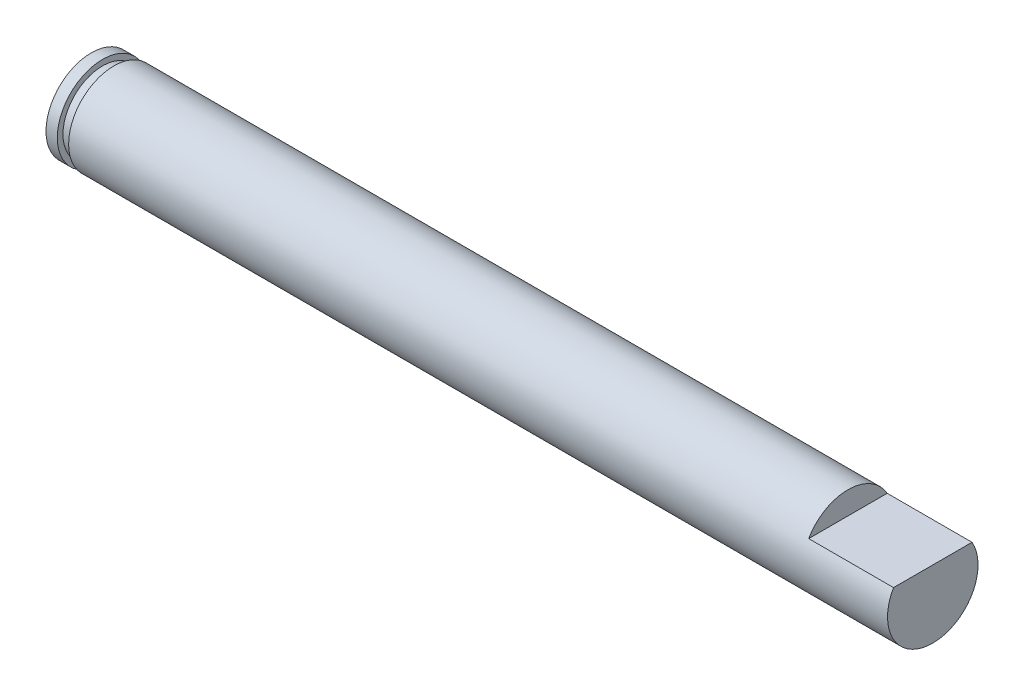
ISO-10303-21;
HEADER;
FILE_DESCRIPTION(('STEP AP214'),'2;1');
FILE_NAME('part.step','',(''),(''),'','','');
FILE_SCHEMA(('AUTOMOTIVE_DESIGN { 1 0 10303 214 1 1 1 1 }'));
ENDSEC;
DATA;
#1=APPLICATION_CONTEXT('core data for automotive mechanical design processes');
#2=APPLICATION_PROTOCOL_DEFINITION('international standard','automotive_design',2000,#1);
#3=PRODUCT_CONTEXT('',#1,'mechanical');
#4=PRODUCT('Part','Part','',(#3));
#5=PRODUCT_RELATED_PRODUCT_CATEGORY('part','',(#4));
#6=PRODUCT_DEFINITION_FORMATION('','',#4);
#7=PRODUCT_DEFINITION_CONTEXT('part definition',#1,'design');
#8=PRODUCT_DEFINITION('design','',#6,#7);
#9=PRODUCT_DEFINITION_SHAPE('','',#8);
#10=(LENGTH_UNIT() NAMED_UNIT(*) SI_UNIT(.MILLI.,.METRE.));
#11=(NAMED_UNIT(*) PLANE_ANGLE_UNIT() SI_UNIT($,.RADIAN.));
#12=(NAMED_UNIT(*) SI_UNIT($,.STERADIAN.) SOLID_ANGLE_UNIT());
#13=UNCERTAINTY_MEASURE_WITH_UNIT(LENGTH_MEASURE(1.E-05),#10,'distance_accuracy_value','');
#14=(GEOMETRIC_REPRESENTATION_CONTEXT(3) GLOBAL_UNCERTAINTY_ASSIGNED_CONTEXT((#13)) GLOBAL_UNIT_ASSIGNED_CONTEXT((#10,
#11,#12)) REPRESENTATION_CONTEXT('',''));
#15=CARTESIAN_POINT('',(0.,0.,0.));
#16=DIRECTION('',(0.,0.,1.));
#17=DIRECTION('',(1.,0.,0.));
#18=AXIS2_PLACEMENT_3D('',#15,#16,#17);
#19=CARTESIAN_POINT('',(78.2137084989847,0.,0.));
#20=DIRECTION('',(-1.,0.,0.));
#21=DIRECTION('',(0.,0.,1.));
#22=AXIS2_PLACEMENT_3D('',#19,#20,#21);
#23=CYLINDRICAL_SURFACE('',#22,4.);
#24=CARTESIAN_POINT('',(0.,0.,0.));
#25=DIRECTION('',(1.,0.,0.));
#26=DIRECTION('',(0.,0.,-1.));
#27=AXIS2_PLACEMENT_3D('',#24,#25,#26);
#28=CIRCLE('',#27,4.);
#29=CARTESIAN_POINT('',(0.,0.,-4.));
#30=VERTEX_POINT('',#29);
#31=EDGE_CURVE('E46',#30,#30,#28,.T.);
#32=ORIENTED_EDGE('',*,*,#31,.T.);
#33=EDGE_LOOP('',(#32));
#34=FACE_BOUND('',#33,.T.);
#35=CARTESIAN_POINT('',(1.,0.,0.));
#36=DIRECTION('',(-1.,0.,0.));
#37=DIRECTION('',(0.,0.,1.));
#38=AXIS2_PLACEMENT_3D('',#35,#36,#37);
#39=CIRCLE('',#38,4.);
#40=CARTESIAN_POINT('',(1.,0.,4.));
#41=VERTEX_POINT('',#40);
#42=EDGE_CURVE('E123',#41,#41,#39,.T.);
#43=ORIENTED_EDGE('',*,*,#42,.T.);
#44=EDGE_LOOP('',(#43));
#45=FACE_BOUND('',#44,.T.);
#46=ADVANCED_FACE('F39',(#34,#45),#23,.T.);
#47=CARTESIAN_POINT('',(0.,0.,0.));
#48=DIRECTION('',(1.,0.,0.));
#49=DIRECTION('',(0.,0.,-1.));
#50=AXIS2_PLACEMENT_3D('',#47,#48,#49);
#51=PLANE('',#50);
#52=ORIENTED_EDGE('',*,*,#31,.F.);
#53=EDGE_LOOP('',(#52));
#54=FACE_BOUND('',#53,.T.);
#55=ADVANCED_FACE('F86',(#54),#51,.F.);
#56=CARTESIAN_POINT('',(1.,4.,0.));
#57=DIRECTION('',(1.,0.,0.));
#58=DIRECTION('',(0.,0.,-1.));
#59=AXIS2_PLACEMENT_3D('',#56,#57,#58);
#60=PLANE('',#59);
#61=CARTESIAN_POINT('',(1.,0.,0.));
#62=DIRECTION('',(-1.,0.,0.));
#63=DIRECTION('',(0.,0.,1.));
#64=AXIS2_PLACEMENT_3D('',#61,#62,#63);
#65=CIRCLE('',#64,3.5);
#66=CARTESIAN_POINT('',(1.,0.,3.5));
#67=VERTEX_POINT('',#66);
#68=EDGE_CURVE('E74',#67,#67,#65,.T.);
#69=ORIENTED_EDGE('',*,*,#68,.T.);
#70=EDGE_LOOP('',(#69));
#71=FACE_BOUND('',#70,.T.);
#72=ORIENTED_EDGE('',*,*,#42,.F.);
#73=EDGE_LOOP('',(#72));
#74=FACE_BOUND('',#73,.T.);
#75=ADVANCED_FACE('F88',(#71,#74),#60,.T.);
#76=CARTESIAN_POINT('',(0.,0.,0.));
#77=DIRECTION('',(-1.,0.,0.));
#78=DIRECTION('',(0.,0.,1.));
#79=AXIS2_PLACEMENT_3D('',#76,#77,#78);
#80=CYLINDRICAL_SURFACE('',#79,3.5);
#81=CARTESIAN_POINT('',(2.,0.,0.));
#82=DIRECTION('',(-1.,0.,0.));
#83=DIRECTION('',(0.,0.,1.));
#84=AXIS2_PLACEMENT_3D('',#81,#82,#83);
#85=CIRCLE('',#84,3.5);
#86=CARTESIAN_POINT('',(2.,0.,3.5));
#87=VERTEX_POINT('',#86);
#88=EDGE_CURVE('E119',#87,#87,#85,.T.);
#89=ORIENTED_EDGE('',*,*,#88,.T.);
#90=EDGE_LOOP('',(#89));
#91=FACE_BOUND('',#90,.T.);
#92=ORIENTED_EDGE('',*,*,#68,.F.);
#93=EDGE_LOOP('',(#92));
#94=FACE_BOUND('',#93,.T.);
#95=ADVANCED_FACE('F93',(#91,#94),#80,.T.);
#96=CARTESIAN_POINT('',(2.,4.,0.));
#97=DIRECTION('',(-1.,0.,0.));
#98=DIRECTION('',(0.,0.,1.));
#99=AXIS2_PLACEMENT_3D('',#96,#97,#98);
#100=PLANE('',#99);
#101=CARTESIAN_POINT('',(2.,0.,0.));
#102=DIRECTION('',(-1.,0.,0.));
#103=DIRECTION('',(0.,0.,1.));
#104=AXIS2_PLACEMENT_3D('',#101,#102,#103);
#105=CIRCLE('',#104,4.);
#106=CARTESIAN_POINT('',(2.,0.,4.));
#107=VERTEX_POINT('',#106);
#108=EDGE_CURVE('E116',#107,#107,#105,.T.);
#109=ORIENTED_EDGE('',*,*,#108,.T.);
#110=EDGE_LOOP('',(#109));
#111=FACE_BOUND('',#110,.T.);
#112=ORIENTED_EDGE('',*,*,#88,.F.);
#113=EDGE_LOOP('',(#112));
#114=FACE_BOUND('',#113,.T.);
#115=ADVANCED_FACE('F103',(#111,#114),#100,.T.);
#116=CARTESIAN_POINT('',(74.4,0.,0.));
#117=DIRECTION('',(1.,0.,0.));
#118=DIRECTION('',(0.,0.,-1.));
#119=AXIS2_PLACEMENT_3D('',#116,#117,#118);
#120=PLANE('',#119);
#121=CARTESIAN_POINT('',(74.4,0.,0.));
#122=DIRECTION('',(1.,0.,0.));
#123=DIRECTION('',(0.,0.,-1.));
#124=AXIS2_PLACEMENT_3D('',#121,#122,#123);
#125=CIRCLE('',#124,4.);
#126=CARTESIAN_POINT('',(74.4,1.99,3.46985590478913));
#127=VERTEX_POINT('',#126);
#128=CARTESIAN_POINT('',(74.4,1.99,-3.46985590478913));
#129=VERTEX_POINT('',#128);
#130=EDGE_CURVE('E73',#127,#129,#125,.T.);
#131=ORIENTED_EDGE('',*,*,#130,.T.);
#132=DIRECTION('',(0.,0.,1.));
#133=VECTOR('',#132,1.);
#134=CARTESIAN_POINT('',(74.4,1.99,3.46985590478913));
#135=LINE('',#134,#133);
#136=EDGE_CURVE('E59',#129,#127,#135,.T.);
#137=ORIENTED_EDGE('',*,*,#136,.T.);
#138=EDGE_LOOP('',(#131,#137));
#139=FACE_BOUND('',#138,.T.);
#140=ADVANCED_FACE('F101',(#139),#120,.T.);
#141=CARTESIAN_POINT('',(74.4,1.99,3.46985590478913));
#142=DIRECTION('',(0.,-1.,0.));
#143=DIRECTION('',(0.,0.,-1.));
#144=AXIS2_PLACEMENT_3D('',#141,#142,#143);
#145=PLANE('',#144);
#146=DIRECTION('',(0.,0.,1.));
#147=VECTOR('',#146,1.);
#148=CARTESIAN_POINT('',(66.9,1.99,3.46985590478913));
#149=LINE('',#148,#147);
#150=CARTESIAN_POINT('',(66.9,1.99,-3.46985590478913));
#151=VERTEX_POINT('',#150);
#152=CARTESIAN_POINT('',(66.9,1.99,3.46985590478913));
#153=VERTEX_POINT('',#152);
#154=EDGE_CURVE('E52',#151,#153,#149,.T.);
#155=ORIENTED_EDGE('',*,*,#154,.T.);
#156=DIRECTION('',(-1.,0.,0.));
#157=VECTOR('',#156,1.);
#158=CARTESIAN_POINT('',(74.4,1.99,3.46985590478913));
#159=LINE('',#158,#157);
#160=EDGE_CURVE('E70',#127,#153,#159,.T.);
#161=ORIENTED_EDGE('',*,*,#160,.F.);
#162=ORIENTED_EDGE('',*,*,#136,.F.);
#163=DIRECTION('',(-1.,0.,0.));
#164=VECTOR('',#163,1.);
#165=CARTESIAN_POINT('',(74.4,1.99,-3.46985590478913));
#166=LINE('',#165,#164);
#167=EDGE_CURVE('E72',#129,#151,#166,.T.);
#168=ORIENTED_EDGE('',*,*,#167,.T.);
#169=EDGE_LOOP('',(#155,#161,#162,#168));
#170=FACE_BOUND('',#169,.T.);
#171=ADVANCED_FACE('F69',(#170),#145,.F.);
#172=CARTESIAN_POINT('',(66.9,0.,0.));
#173=DIRECTION('',(-1.,0.,0.));
#174=DIRECTION('',(0.,0.968948989481064,-0.247260704083009));
#175=AXIS2_PLACEMENT_3D('',#172,#173,#174);
#176=PLANE('',#175);
#177=ORIENTED_EDGE('',*,*,#154,.F.);
#178=CARTESIAN_POINT('',(66.9,0.,0.));
#179=DIRECTION('',(-1.,0.,0.));
#180=DIRECTION('',(0.,0.,1.));
#181=AXIS2_PLACEMENT_3D('',#178,#179,#180);
#182=CIRCLE('',#181,4.);
#183=EDGE_CURVE('E11',#153,#151,#182,.T.);
#184=ORIENTED_EDGE('',*,*,#183,.F.);
#185=EDGE_LOOP('',(#177,#184));
#186=FACE_BOUND('',#185,.T.);
#187=ADVANCED_FACE('F63',(#186),#176,.F.);
#188=ORIENTED_EDGE('',*,*,#183,.T.);
#189=ORIENTED_EDGE('',*,*,#167,.F.);
#190=ORIENTED_EDGE('',*,*,#130,.F.);
#191=ORIENTED_EDGE('',*,*,#160,.T.);
#192=EDGE_LOOP('',(#188,#189,#190,#191));
#193=FACE_BOUND('',#192,.T.);
#194=ORIENTED_EDGE('',*,*,#108,.F.);
#195=EDGE_LOOP('',(#194));
#196=FACE_BOUND('',#195,.T.);
#197=ADVANCED_FACE('F76',(#193,#196),#23,.T.);
#198=CLOSED_SHELL('',(#46,#55,#75,#95,#115,#140,#171,#187,#197));
#199=MANIFOLD_SOLID_BREP('B2',#198);
#200=ADVANCED_BREP_SHAPE_REPRESENTATION('',(#18,#199),#14);
#201=SHAPE_DEFINITION_REPRESENTATION(#9,#200);
ENDSEC;
END-ISO-10303-21;
